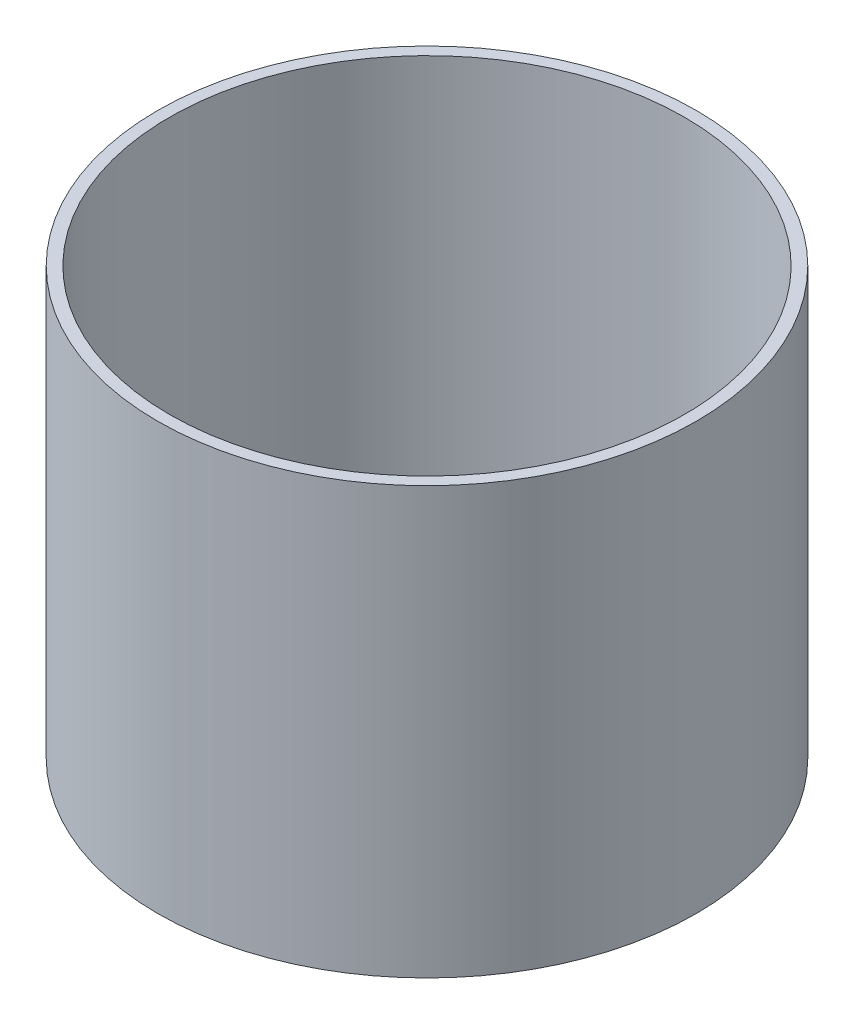
ISO-10303-21;
HEADER;
FILE_DESCRIPTION(('STEP AP214'),'2;1');
FILE_NAME('part.step','',(''),(''),'','','');
FILE_SCHEMA(('AUTOMOTIVE_DESIGN { 1 0 10303 214 1 1 1 1 }'));
ENDSEC;
DATA;
#1=APPLICATION_CONTEXT('core data for automotive mechanical design processes');
#2=APPLICATION_PROTOCOL_DEFINITION('international standard','automotive_design',2000,#1);
#3=PRODUCT_CONTEXT('',#1,'mechanical');
#4=PRODUCT('Part','Part','',(#3));
#5=PRODUCT_RELATED_PRODUCT_CATEGORY('part','',(#4));
#6=PRODUCT_DEFINITION_FORMATION('','',#4);
#7=PRODUCT_DEFINITION_CONTEXT('part definition',#1,'design');
#8=PRODUCT_DEFINITION('design','',#6,#7);
#9=PRODUCT_DEFINITION_SHAPE('','',#8);
#10=(LENGTH_UNIT() NAMED_UNIT(*) SI_UNIT(.MILLI.,.METRE.));
#11=(NAMED_UNIT(*) PLANE_ANGLE_UNIT() SI_UNIT($,.RADIAN.));
#12=(NAMED_UNIT(*) SI_UNIT($,.STERADIAN.) SOLID_ANGLE_UNIT());
#13=UNCERTAINTY_MEASURE_WITH_UNIT(LENGTH_MEASURE(1.E-05),#10,'distance_accuracy_value','');
#14=(GEOMETRIC_REPRESENTATION_CONTEXT(3) GLOBAL_UNCERTAINTY_ASSIGNED_CONTEXT((#13)) GLOBAL_UNIT_ASSIGNED_CONTEXT((#10,
#11,#12)) REPRESENTATION_CONTEXT('',''));
#15=CARTESIAN_POINT('',(0.,0.,0.));
#16=DIRECTION('',(0.,0.,1.));
#17=DIRECTION('',(1.,0.,0.));
#18=AXIS2_PLACEMENT_3D('',#15,#16,#17);
#19=CARTESIAN_POINT('',(0.,-85.4875,0.));
#20=DIRECTION('',(0.,1.,0.));
#21=DIRECTION('',(0.,0.,1.));
#22=AXIS2_PLACEMENT_3D('',#19,#20,#21);
#23=PLANE('',#22);
#24=CARTESIAN_POINT('',(0.,-85.4875,0.));
#25=DIRECTION('',(0.,-1.,0.));
#26=DIRECTION('',(0.,0.,-1.));
#27=AXIS2_PLACEMENT_3D('',#24,#25,#26);
#28=CIRCLE('',#27,109.3);
#29=CARTESIAN_POINT('',(0.,-85.4875,-109.3));
#30=VERTEX_POINT('',#29);
#31=EDGE_CURVE('E10',#30,#30,#28,.T.);
#32=ORIENTED_EDGE('',*,*,#31,.F.);
#33=EDGE_LOOP('',(#32));
#34=FACE_BOUND('',#33,.T.);
#35=ADVANCED_FACE('F37',(#34),#23,.T.);
#36=CARTESIAN_POINT('',(0.,-167.349469112004,0.));
#37=DIRECTION('',(0.,-1.,0.));
#38=DIRECTION('',(0.,0.,-1.));
#39=AXIS2_PLACEMENT_3D('',#36,#37,#38);
#40=CYLINDRICAL_SURFACE('',#39,109.3);
#41=ORIENTED_EDGE('',*,*,#31,.T.);
#42=EDGE_LOOP('',(#41));
#43=FACE_BOUND('',#42,.T.);
#44=CARTESIAN_POINT('',(0.,90.4875,0.));
#45=DIRECTION('',(0.,-1.,0.));
#46=DIRECTION('',(0.,0.,-1.));
#47=AXIS2_PLACEMENT_3D('',#44,#45,#46);
#48=CIRCLE('',#47,109.3);
#49=CARTESIAN_POINT('',(0.,90.4875,-109.3));
#50=VERTEX_POINT('',#49);
#51=EDGE_CURVE('E44',#50,#50,#48,.T.);
#52=ORIENTED_EDGE('',*,*,#51,.F.);
#53=EDGE_LOOP('',(#52));
#54=FACE_BOUND('',#53,.T.);
#55=ADVANCED_FACE('F73',(#43,#54),#40,.F.);
#56=CARTESIAN_POINT('',(109.3,90.4875,0.));
#57=DIRECTION('',(0.,1.,0.));
#58=DIRECTION('',(0.,0.,1.));
#59=AXIS2_PLACEMENT_3D('',#56,#57,#58);
#60=PLANE('',#59);
#61=ORIENTED_EDGE('',*,*,#51,.T.);
#62=EDGE_LOOP('',(#61));
#63=FACE_BOUND('',#62,.T.);
#64=CARTESIAN_POINT('',(0.,90.4875,0.));
#65=DIRECTION('',(0.,-1.,0.));
#66=DIRECTION('',(0.,0.,-1.));
#67=AXIS2_PLACEMENT_3D('',#64,#65,#66);
#68=CIRCLE('',#67,114.3);
#69=CARTESIAN_POINT('',(0.,90.4875,-114.3));
#70=VERTEX_POINT('',#69);
#71=EDGE_CURVE('E49',#70,#70,#68,.T.);
#72=ORIENTED_EDGE('',*,*,#71,.F.);
#73=EDGE_LOOP('',(#72));
#74=FACE_BOUND('',#73,.T.);
#75=ADVANCED_FACE('F65',(#63,#74),#60,.T.);
#76=CARTESIAN_POINT('',(0.,-167.349469112004,0.));
#77=DIRECTION('',(0.,-1.,0.));
#78=DIRECTION('',(0.,0.,-1.));
#79=AXIS2_PLACEMENT_3D('',#76,#77,#78);
#80=CYLINDRICAL_SURFACE('',#79,114.3);
#81=ORIENTED_EDGE('',*,*,#71,.T.);
#82=EDGE_LOOP('',(#81));
#83=FACE_BOUND('',#82,.T.);
#84=CARTESIAN_POINT('',(0.,-90.4875,0.));
#85=DIRECTION('',(0.,-1.,0.));
#86=DIRECTION('',(0.,0.,-1.));
#87=AXIS2_PLACEMENT_3D('',#84,#85,#86);
#88=CIRCLE('',#87,114.3);
#89=CARTESIAN_POINT('',(0.,-90.4875,-114.3));
#90=VERTEX_POINT('',#89);
#91=EDGE_CURVE('E54',#90,#90,#88,.T.);
#92=ORIENTED_EDGE('',*,*,#91,.F.);
#93=EDGE_LOOP('',(#92));
#94=FACE_BOUND('',#93,.T.);
#95=ADVANCED_FACE('F63',(#83,#94),#80,.T.);
#96=CARTESIAN_POINT('',(114.3,-90.4875,0.));
#97=DIRECTION('',(0.,-1.,0.));
#98=DIRECTION('',(0.,0.,-1.));
#99=AXIS2_PLACEMENT_3D('',#96,#97,#98);
#100=PLANE('',#99);
#101=ORIENTED_EDGE('',*,*,#91,.T.);
#102=EDGE_LOOP('',(#101));
#103=FACE_BOUND('',#102,.T.);
#104=ADVANCED_FACE('F61',(#103),#100,.T.);
#105=CLOSED_SHELL('',(#35,#55,#75,#95,#104));
#106=MANIFOLD_SOLID_BREP('B2',#105);
#107=ADVANCED_BREP_SHAPE_REPRESENTATION('',(#18,#106),#14);
#108=SHAPE_DEFINITION_REPRESENTATION(#9,#107);
ENDSEC;
END-ISO-10303-21;
